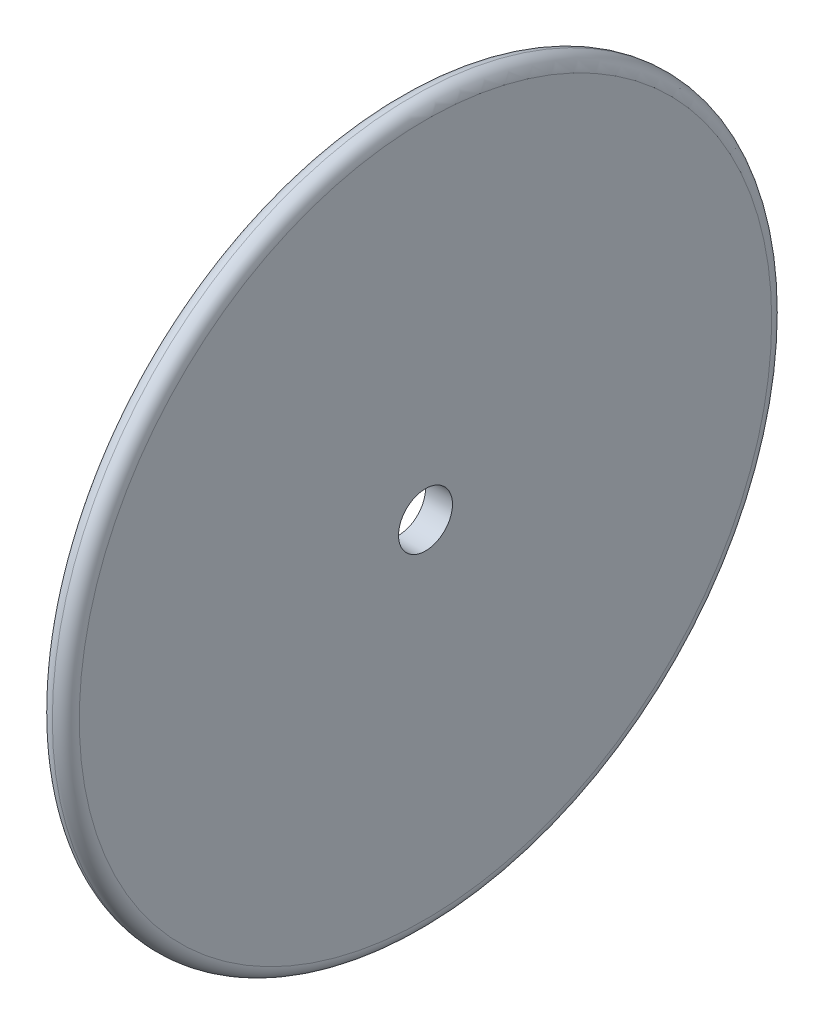
ISO-10303-21;
HEADER;
FILE_DESCRIPTION(('STEP AP214'),'2;1');
FILE_NAME('part.step','',(''),(''),'','','');
FILE_SCHEMA(('AUTOMOTIVE_DESIGN { 1 0 10303 214 1 1 1 1 }'));
ENDSEC;
DATA;
#1=APPLICATION_CONTEXT('core data for automotive mechanical design processes');
#2=APPLICATION_PROTOCOL_DEFINITION('international standard','automotive_design',2000,#1);
#3=PRODUCT_CONTEXT('',#1,'mechanical');
#4=PRODUCT('Part','Part','',(#3));
#5=PRODUCT_RELATED_PRODUCT_CATEGORY('part','',(#4));
#6=PRODUCT_DEFINITION_FORMATION('','',#4);
#7=PRODUCT_DEFINITION_CONTEXT('part definition',#1,'design');
#8=PRODUCT_DEFINITION('design','',#6,#7);
#9=PRODUCT_DEFINITION_SHAPE('','',#8);
#10=(LENGTH_UNIT() NAMED_UNIT(*) SI_UNIT(.MILLI.,.METRE.));
#11=(NAMED_UNIT(*) PLANE_ANGLE_UNIT() SI_UNIT($,.RADIAN.));
#12=(NAMED_UNIT(*) SI_UNIT($,.STERADIAN.) SOLID_ANGLE_UNIT());
#13=UNCERTAINTY_MEASURE_WITH_UNIT(LENGTH_MEASURE(1.E-05),#10,'distance_accuracy_value','');
#14=(GEOMETRIC_REPRESENTATION_CONTEXT(3) GLOBAL_UNCERTAINTY_ASSIGNED_CONTEXT((#13)) GLOBAL_UNIT_ASSIGNED_CONTEXT((#10,
#11,#12)) REPRESENTATION_CONTEXT('',''));
#15=CARTESIAN_POINT('',(0.,0.,0.));
#16=DIRECTION('',(0.,0.,1.));
#17=DIRECTION('',(1.,0.,0.));
#18=AXIS2_PLACEMENT_3D('',#15,#16,#17);
#19=CARTESIAN_POINT('',(1.5,0.,0.));
#20=DIRECTION('',(1.,0.,0.));
#21=DIRECTION('',(0.,0.,-1.));
#22=AXIS2_PLACEMENT_3D('',#19,#20,#21);
#23=PLANE('',#22);
#24=CARTESIAN_POINT('',(1.5,0.,0.));
#25=DIRECTION('',(1.,0.,0.));
#26=DIRECTION('',(0.,0.,-1.));
#27=AXIS2_PLACEMENT_3D('',#24,#25,#26);
#28=CIRCLE('',#27,19.25);
#29=CARTESIAN_POINT('',(1.5,0.,-19.25));
#30=VERTEX_POINT('',#29);
#31=EDGE_CURVE('E52',#30,#30,#28,.T.);
#32=ORIENTED_EDGE('',*,*,#31,.T.);
#33=EDGE_LOOP('',(#32));
#34=FACE_BOUND('',#33,.T.);
#35=CARTESIAN_POINT('',(1.5,0.,0.));
#36=DIRECTION('',(1.,0.,0.));
#37=DIRECTION('',(0.,0.,-1.));
#38=AXIS2_PLACEMENT_3D('',#35,#36,#37);
#39=CIRCLE('',#38,1.5);
#40=CARTESIAN_POINT('',(1.5,0.,-1.5));
#41=VERTEX_POINT('',#40);
#42=EDGE_CURVE('E57',#41,#41,#39,.T.);
#43=ORIENTED_EDGE('',*,*,#42,.F.);
#44=EDGE_LOOP('',(#43));
#45=FACE_BOUND('',#44,.T.);
#46=ADVANCED_FACE('F43',(#34,#45),#23,.T.);
#47=CARTESIAN_POINT('',(0.,0.,0.));
#48=DIRECTION('',(1.,0.,0.));
#49=DIRECTION('',(0.,0.,-1.));
#50=AXIS2_PLACEMENT_3D('',#47,#48,#49);
#51=PLANE('',#50);
#52=CARTESIAN_POINT('',(0.,0.,0.));
#53=DIRECTION('',(1.,0.,0.));
#54=DIRECTION('',(0.,0.,-1.));
#55=AXIS2_PLACEMENT_3D('',#52,#53,#54);
#56=CIRCLE('',#55,19.25);
#57=CARTESIAN_POINT('',(0.,0.,-19.25));
#58=VERTEX_POINT('',#57);
#59=EDGE_CURVE('E10',#58,#58,#56,.F.);
#60=ORIENTED_EDGE('',*,*,#59,.T.);
#61=EDGE_LOOP('',(#60));
#62=FACE_BOUND('',#61,.T.);
#63=CARTESIAN_POINT('',(0.,0.,0.));
#64=DIRECTION('',(1.,0.,0.));
#65=DIRECTION('',(0.,0.,-1.));
#66=AXIS2_PLACEMENT_3D('',#63,#64,#65);
#67=CIRCLE('',#66,1.5);
#68=CARTESIAN_POINT('',(0.,0.,-1.5));
#69=VERTEX_POINT('',#68);
#70=EDGE_CURVE('E60',#69,#69,#67,.T.);
#71=ORIENTED_EDGE('',*,*,#70,.T.);
#72=EDGE_LOOP('',(#71));
#73=FACE_BOUND('',#72,.T.);
#74=ADVANCED_FACE('F72',(#62,#73),#51,.F.);
#75=CARTESIAN_POINT('',(1.5,0.,0.));
#76=DIRECTION('',(-1.,0.,0.));
#77=DIRECTION('',(0.,0.,1.));
#78=AXIS2_PLACEMENT_3D('',#75,#76,#77);
#79=CYLINDRICAL_SURFACE('',#78,1.5);
#80=ORIENTED_EDGE('',*,*,#42,.T.);
#81=EDGE_LOOP('',(#80));
#82=FACE_BOUND('',#81,.T.);
#83=ORIENTED_EDGE('',*,*,#70,.F.);
#84=EDGE_LOOP('',(#83));
#85=FACE_BOUND('',#84,.T.);
#86=ADVANCED_FACE('F68',(#82,#85),#79,.F.);
#87=CARTESIAN_POINT('',(0.75,0.,0.));
#88=DIRECTION('',(1.,0.,0.));
#89=DIRECTION('',(0.,0.,-1.));
#90=AXIS2_PLACEMENT_3D('',#87,#88,#89);
#91=TOROIDAL_SURFACE('',#90,19.25,0.75);
#92=ORIENTED_EDGE('',*,*,#59,.F.);
#93=EDGE_LOOP('',(#92));
#94=FACE_BOUND('',#93,.T.);
#95=CARTESIAN_POINT('',(0.75,0.,0.));
#96=DIRECTION('',(1.,0.,0.));
#97=DIRECTION('',(0.,0.,-1.));
#98=AXIS2_PLACEMENT_3D('',#95,#96,#97);
#99=CIRCLE('',#98,20.);
#100=CARTESIAN_POINT('',(0.75,0.,-20.));
#101=VERTEX_POINT('',#100);
#102=EDGE_CURVE('E47',#101,#101,#99,.T.);
#103=ORIENTED_EDGE('',*,*,#102,.F.);
#104=EDGE_LOOP('',(#103));
#105=FACE_BOUND('',#104,.T.);
#106=ADVANCED_FACE('F45',(#94,#105),#91,.T.);
#107=CARTESIAN_POINT('',(0.75,0.,0.));
#108=DIRECTION('',(1.,0.,0.));
#109=DIRECTION('',(0.,0.,-1.));
#110=AXIS2_PLACEMENT_3D('',#107,#108,#109);
#111=TOROIDAL_SURFACE('',#110,19.25,0.75);
#112=ORIENTED_EDGE('',*,*,#102,.T.);
#113=EDGE_LOOP('',(#112));
#114=FACE_BOUND('',#113,.T.);
#115=ORIENTED_EDGE('',*,*,#31,.F.);
#116=EDGE_LOOP('',(#115));
#117=FACE_BOUND('',#116,.T.);
#118=ADVANCED_FACE('F81',(#114,#117),#111,.T.);
#119=CLOSED_SHELL('',(#46,#74,#86,#106,#118));
#120=MANIFOLD_SOLID_BREP('B2',#119);
#121=ADVANCED_BREP_SHAPE_REPRESENTATION('',(#18,#120),#14);
#122=SHAPE_DEFINITION_REPRESENTATION(#9,#121);
ENDSEC;
END-ISO-10303-21;
